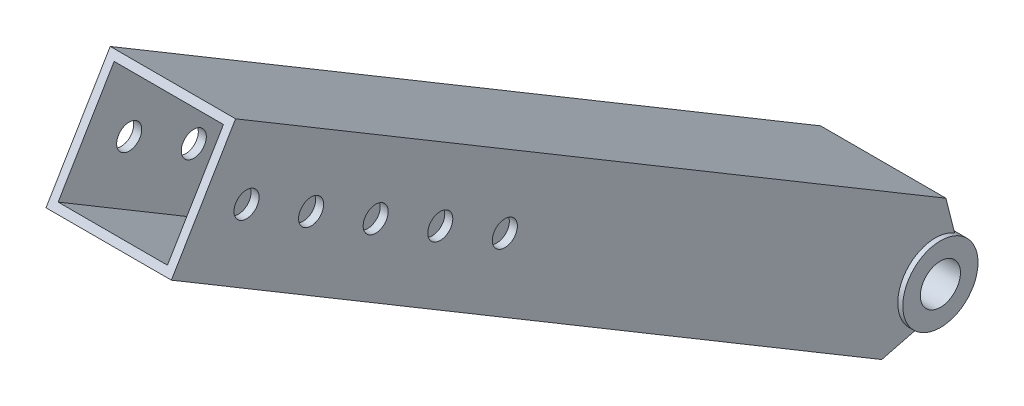
ISO-10303-21;
HEADER;
FILE_DESCRIPTION(('STEP AP214'),'2;1');
FILE_NAME('part.step','',(''),(''),'','','');
FILE_SCHEMA(('AUTOMOTIVE_DESIGN { 1 0 10303 214 1 1 1 1 }'));
ENDSEC;
DATA;
#1=APPLICATION_CONTEXT('core data for automotive mechanical design processes');
#2=APPLICATION_PROTOCOL_DEFINITION('international standard','automotive_design',2000,#1);
#3=PRODUCT_CONTEXT('',#1,'mechanical');
#4=PRODUCT('Part','Part','',(#3));
#5=PRODUCT_RELATED_PRODUCT_CATEGORY('part','',(#4));
#6=PRODUCT_DEFINITION_FORMATION('','',#4);
#7=PRODUCT_DEFINITION_CONTEXT('part definition',#1,'design');
#8=PRODUCT_DEFINITION('design','',#6,#7);
#9=PRODUCT_DEFINITION_SHAPE('','',#8);
#10=(LENGTH_UNIT() NAMED_UNIT(*) SI_UNIT(.MILLI.,.METRE.));
#11=(NAMED_UNIT(*) PLANE_ANGLE_UNIT() SI_UNIT($,.RADIAN.));
#12=(NAMED_UNIT(*) SI_UNIT($,.STERADIAN.) SOLID_ANGLE_UNIT());
#13=UNCERTAINTY_MEASURE_WITH_UNIT(LENGTH_MEASURE(1.E-05),#10,'distance_accuracy_value','');
#14=(GEOMETRIC_REPRESENTATION_CONTEXT(3) GLOBAL_UNCERTAINTY_ASSIGNED_CONTEXT((#13)) GLOBAL_UNIT_ASSIGNED_CONTEXT((#10,
#11,#12)) REPRESENTATION_CONTEXT('',''));
#15=CARTESIAN_POINT('',(0.,0.,0.));
#16=DIRECTION('',(0.,0.,1.));
#17=DIRECTION('',(1.,0.,0.));
#18=AXIS2_PLACEMENT_3D('',#15,#16,#17);
#19=CARTESIAN_POINT('',(12.5,50.2404489018823,-146.473206748013));
#20=DIRECTION('',(1.,0.,0.));
#21=DIRECTION('',(0.,0.,-1.));
#22=AXIS2_PLACEMENT_3D('',#19,#20,#21);
#23=PLANE('',#22);
#24=CARTESIAN_POINT('',(12.5,25.1008890559165,-212.988261666063));
#25=DIRECTION('',(1.,0.,0.));
#26=DIRECTION('',(0.,0.,-1.));
#27=AXIS2_PLACEMENT_3D('',#24,#25,#26);
#28=CIRCLE('',#27,2.5);
#29=CARTESIAN_POINT('',(12.5,25.1008890559165,-215.488261666063));
#30=VERTEX_POINT('',#29);
#31=EDGE_CURVE('E236',#30,#30,#28,.T.);
#32=ORIENTED_EDGE('',*,*,#31,.F.);
#33=EDGE_LOOP('',(#32));
#34=FACE_BOUND('',#33,.T.);
#35=CARTESIAN_POINT('',(12.5,32.7880308379483,-200.107739501844));
#36=DIRECTION('',(1.,0.,0.));
#37=DIRECTION('',(0.,0.,-1.));
#38=AXIS2_PLACEMENT_3D('',#35,#36,#37);
#39=CIRCLE('',#38,2.5);
#40=CARTESIAN_POINT('',(12.5,32.7880308379483,-202.607739501844));
#41=VERTEX_POINT('',#40);
#42=EDGE_CURVE('E226',#41,#41,#39,.T.);
#43=ORIENTED_EDGE('',*,*,#42,.F.);
#44=EDGE_LOOP('',(#43));
#45=FACE_BOUND('',#44,.T.);
#46=CARTESIAN_POINT('',(12.5,40.4751726199801,-187.227217337624));
#47=DIRECTION('',(1.,0.,0.));
#48=DIRECTION('',(0.,0.,-1.));
#49=AXIS2_PLACEMENT_3D('',#46,#47,#48);
#50=CIRCLE('',#49,2.5);
#51=CARTESIAN_POINT('',(12.5,40.4751726199801,-189.727217337624));
#52=VERTEX_POINT('',#51);
#53=EDGE_CURVE('E216',#52,#52,#50,.T.);
#54=ORIENTED_EDGE('',*,*,#53,.F.);
#55=EDGE_LOOP('',(#54));
#56=FACE_BOUND('',#55,.T.);
#57=CARTESIAN_POINT('',(12.5,48.1623144020119,-174.346695173405));
#58=DIRECTION('',(1.,0.,0.));
#59=DIRECTION('',(0.,0.,-1.));
#60=AXIS2_PLACEMENT_3D('',#57,#58,#59);
#61=CIRCLE('',#60,2.5);
#62=CARTESIAN_POINT('',(12.5,48.1623144020119,-176.846695173405));
#63=VERTEX_POINT('',#62);
#64=EDGE_CURVE('E206',#63,#63,#61,.T.);
#65=ORIENTED_EDGE('',*,*,#64,.F.);
#66=EDGE_LOOP('',(#65));
#67=FACE_BOUND('',#66,.T.);
#68=CARTESIAN_POINT('',(12.5,55.8494561840437,-161.466173009186));
#69=DIRECTION('',(1.,0.,0.));
#70=DIRECTION('',(0.,0.,-1.));
#71=AXIS2_PLACEMENT_3D('',#68,#69,#70);
#72=CIRCLE('',#71,2.5);
#73=CARTESIAN_POINT('',(12.5,55.8494561840437,-163.966173009186));
#74=VERTEX_POINT('',#73);
#75=EDGE_CURVE('E194',#74,#74,#72,.T.);
#76=ORIENTED_EDGE('',*,*,#75,.F.);
#77=EDGE_LOOP('',(#76));
#78=FACE_BOUND('',#77,.T.);
#79=CARTESIAN_POINT('',(12.5,-26.1467228242954,-298.858409427524));
#80=DIRECTION('',(1.,0.,0.));
#81=DIRECTION('',(0.,0.,-1.));
#82=AXIS2_PLACEMENT_3D('',#79,#80,#81);
#83=CIRCLE('',#82,7.50000000000001);
#84=CARTESIAN_POINT('',(12.5,-19.7064617421858,-302.70198031854));
#85=VERTEX_POINT('',#84);
#86=CARTESIAN_POINT('',(12.5,-32.586983906405,-295.014838536508));
#87=VERTEX_POINT('',#86);
#88=EDGE_CURVE('E165',#85,#87,#83,.T.);
#89=ORIENTED_EDGE('',*,*,#88,.F.);
#90=DIRECTION('',(0.,-0.969568976637342,-0.244818299035056));
#91=VECTOR('',#90,1.);
#92=CARTESIAN_POINT('',(12.5,83.1318579890687,-276.735078407603));
#93=LINE('',#92,#91);
#94=CARTESIAN_POINT('',(12.5,-12.8505737601021,-300.970853524477));
#95=VERTEX_POINT('',#94);
#96=EDGE_CURVE('E164',#85,#95,#93,.F.);
#97=ORIENTED_EDGE('',*,*,#96,.T.);
#98=DIRECTION('',(0.,-0.512476118802119,-0.858701477614611));
#99=VECTOR('',#98,1.);
#100=CARTESIAN_POINT('',(12.5,71.7079858422476,-159.285109718066));
#101=LINE('',#100,#99);
#102=CARTESIAN_POINT('',(12.5,71.7079858422476,-159.285109718066));
#103=VERTEX_POINT('',#102);
#104=EDGE_CURVE('E159',#103,#95,#101,.T.);
#105=ORIENTED_EDGE('',*,*,#104,.F.);
#106=DIRECTION('',(0.,-0.858701477614611,0.512476118802119));
#107=VECTOR('',#106,1.);
#108=CARTESIAN_POINT('',(12.5,50.2404489018823,-146.473206748013));
#109=LINE('',#108,#107);
#110=CARTESIAN_POINT('',(12.5,50.2404489018823,-146.473206748013));
#111=VERTEX_POINT('',#110);
#112=EDGE_CURVE('E518',#103,#111,#109,.T.);
#113=ORIENTED_EDGE('',*,*,#112,.T.);
#114=DIRECTION('',(0.,-0.512476118802119,-0.858701477614611));
#115=VECTOR('',#114,1.);
#116=CARTESIAN_POINT('',(12.5,50.2404489018823,-146.473206748013));
#117=LINE('',#116,#115);
#118=CARTESIAN_POINT('',(12.5,-34.3181107004674,-288.158950554424));
#119=VERTEX_POINT('',#118);
#120=EDGE_CURVE('E508',#111,#119,#117,.T.);
#121=ORIENTED_EDGE('',*,*,#120,.T.);
#122=DIRECTION('',(0.,-0.244818299035069,0.969568976637338));
#123=VECTOR('',#122,1.);
#124=CARTESIAN_POINT('',(12.5,-62.8817028024989,-175.036798850046));
#125=LINE('',#124,#123);
#126=EDGE_CURVE('E146',#119,#87,#125,.F.);
#127=ORIENTED_EDGE('',*,*,#126,.T.);
#128=EDGE_LOOP('',(#89,#97,#105,#113,#121,#127));
#129=FACE_BOUND('',#128,.T.);
#130=ADVANCED_FACE('F43',(#34,#45,#56,#67,#78,#129),#23,.T.);
#131=CARTESIAN_POINT('',(-12.5,71.7079858422476,-159.285109718066));
#132=DIRECTION('',(0.,0.858701477614611,-0.512476118802119));
#133=DIRECTION('',(0.,0.512476118802119,0.858701477614611));
#134=AXIS2_PLACEMENT_3D('',#131,#132,#133);
#135=PLANE('',#134);
#136=ORIENTED_EDGE('',*,*,#104,.T.);
#137=DIRECTION('',(-1.,0.,0.));
#138=VECTOR('',#137,1.);
#139=CARTESIAN_POINT('',(-12.5,-12.8505737601021,-300.970853524477));
#140=LINE('',#139,#138);
#141=CARTESIAN_POINT('',(-12.5,-12.8505737601021,-300.970853524477));
#142=VERTEX_POINT('',#141);
#143=EDGE_CURVE('E69',#95,#142,#140,.T.);
#144=ORIENTED_EDGE('',*,*,#143,.T.);
#145=DIRECTION('',(0.,-0.512476118802119,-0.858701477614611));
#146=VECTOR('',#145,1.);
#147=CARTESIAN_POINT('',(-12.5,71.7079858422476,-159.285109718066));
#148=LINE('',#147,#146);
#149=CARTESIAN_POINT('',(-12.5,71.7079858422476,-159.285109718066));
#150=VERTEX_POINT('',#149);
#151=EDGE_CURVE('E339',#150,#142,#148,.T.);
#152=ORIENTED_EDGE('',*,*,#151,.F.);
#153=DIRECTION('',(1.,0.,0.));
#154=VECTOR('',#153,1.);
#155=CARTESIAN_POINT('',(-12.5,71.7079858422476,-159.285109718066));
#156=LINE('',#155,#154);
#157=EDGE_CURVE('E510',#150,#103,#156,.T.);
#158=ORIENTED_EDGE('',*,*,#157,.T.);
#159=EDGE_LOOP('',(#136,#144,#152,#158));
#160=FACE_BOUND('',#159,.T.);
#161=ADVANCED_FACE('F267',(#160),#135,.T.);
#162=CARTESIAN_POINT('',(-12.5,50.2404489018823,-146.473206748013));
#163=DIRECTION('',(-1.,0.,0.));
#164=DIRECTION('',(0.,0.,1.));
#165=AXIS2_PLACEMENT_3D('',#162,#163,#164);
#166=PLANE('',#165);
#167=CARTESIAN_POINT('',(-12.5,25.1008890559165,-212.988261666063));
#168=DIRECTION('',(-1.,0.,0.));
#169=DIRECTION('',(0.,0.,1.));
#170=AXIS2_PLACEMENT_3D('',#167,#168,#169);
#171=CIRCLE('',#170,2.5);
#172=CARTESIAN_POINT('',(-12.5,25.1008890559165,-210.488261666063));
#173=VERTEX_POINT('',#172);
#174=EDGE_CURVE('E239',#173,#173,#171,.T.);
#175=ORIENTED_EDGE('',*,*,#174,.F.);
#176=EDGE_LOOP('',(#175));
#177=FACE_BOUND('',#176,.T.);
#178=CARTESIAN_POINT('',(-12.5,32.7880308379483,-200.107739501844));
#179=DIRECTION('',(-1.,0.,0.));
#180=DIRECTION('',(0.,0.,1.));
#181=AXIS2_PLACEMENT_3D('',#178,#179,#180);
#182=CIRCLE('',#181,2.5);
#183=CARTESIAN_POINT('',(-12.5,32.7880308379483,-197.607739501844));
#184=VERTEX_POINT('',#183);
#185=EDGE_CURVE('E229',#184,#184,#182,.T.);
#186=ORIENTED_EDGE('',*,*,#185,.F.);
#187=EDGE_LOOP('',(#186));
#188=FACE_BOUND('',#187,.T.);
#189=CARTESIAN_POINT('',(-12.5,40.4751726199801,-187.227217337624));
#190=DIRECTION('',(-1.,0.,0.));
#191=DIRECTION('',(0.,0.,1.));
#192=AXIS2_PLACEMENT_3D('',#189,#190,#191);
#193=CIRCLE('',#192,2.5);
#194=CARTESIAN_POINT('',(-12.5,40.4751726199801,-184.727217337624));
#195=VERTEX_POINT('',#194);
#196=EDGE_CURVE('E219',#195,#195,#193,.T.);
#197=ORIENTED_EDGE('',*,*,#196,.F.);
#198=EDGE_LOOP('',(#197));
#199=FACE_BOUND('',#198,.T.);
#200=CARTESIAN_POINT('',(-12.5,48.1623144020119,-174.346695173405));
#201=DIRECTION('',(-1.,0.,0.));
#202=DIRECTION('',(0.,0.,1.));
#203=AXIS2_PLACEMENT_3D('',#200,#201,#202);
#204=CIRCLE('',#203,2.5);
#205=CARTESIAN_POINT('',(-12.5,48.1623144020119,-171.846695173405));
#206=VERTEX_POINT('',#205);
#207=EDGE_CURVE('E209',#206,#206,#204,.T.);
#208=ORIENTED_EDGE('',*,*,#207,.F.);
#209=EDGE_LOOP('',(#208));
#210=FACE_BOUND('',#209,.T.);
#211=CARTESIAN_POINT('',(-12.5,55.8494561840437,-161.466173009186));
#212=DIRECTION('',(-1.,0.,0.));
#213=DIRECTION('',(0.,0.,1.));
#214=AXIS2_PLACEMENT_3D('',#211,#212,#213);
#215=CIRCLE('',#214,2.5);
#216=CARTESIAN_POINT('',(-12.5,55.8494561840437,-158.966173009186));
#217=VERTEX_POINT('',#216);
#218=EDGE_CURVE('E199',#217,#217,#215,.T.);
#219=ORIENTED_EDGE('',*,*,#218,.F.);
#220=EDGE_LOOP('',(#219));
#221=FACE_BOUND('',#220,.T.);
#222=ORIENTED_EDGE('',*,*,#151,.T.);
#223=DIRECTION('',(0.,0.969568976637342,0.244818299035056));
#224=VECTOR('',#223,1.);
#225=CARTESIAN_POINT('',(-12.5,83.1318579890687,-276.735078407603));
#226=LINE('',#225,#224);
#227=CARTESIAN_POINT('',(-12.5,-19.7064617421858,-302.70198031854));
#228=VERTEX_POINT('',#227);
#229=EDGE_CURVE('E340',#142,#228,#226,.F.);
#230=ORIENTED_EDGE('',*,*,#229,.T.);
#231=CARTESIAN_POINT('',(-12.5,-26.1467228242954,-298.858409427524));
#232=DIRECTION('',(-1.,0.,0.));
#233=DIRECTION('',(0.,0.,1.));
#234=AXIS2_PLACEMENT_3D('',#231,#232,#233);
#235=CIRCLE('',#234,7.50000000000001);
#236=CARTESIAN_POINT('',(-12.5,-32.586983906405,-295.014838536508));
#237=VERTEX_POINT('',#236);
#238=EDGE_CURVE('E174',#237,#228,#235,.T.);
#239=ORIENTED_EDGE('',*,*,#238,.F.);
#240=DIRECTION('',(0.,0.244818299035069,-0.969568976637338));
#241=VECTOR('',#240,1.);
#242=CARTESIAN_POINT('',(-12.5,-62.8817028024989,-175.036798850046));
#243=LINE('',#242,#241);
#244=CARTESIAN_POINT('',(-12.5,-34.3181107004674,-288.158950554424));
#245=VERTEX_POINT('',#244);
#246=EDGE_CURVE('E61',#237,#245,#243,.F.);
#247=ORIENTED_EDGE('',*,*,#246,.T.);
#248=DIRECTION('',(0.,-0.512476118802119,-0.858701477614611));
#249=VECTOR('',#248,1.);
#250=CARTESIAN_POINT('',(-12.5,50.2404489018823,-146.473206748013));
#251=LINE('',#250,#249);
#252=CARTESIAN_POINT('',(-12.5,50.2404489018823,-146.473206748013));
#253=VERTEX_POINT('',#252);
#254=EDGE_CURVE('E345',#253,#245,#251,.T.);
#255=ORIENTED_EDGE('',*,*,#254,.F.);
#256=DIRECTION('',(0.,0.858701477614611,-0.512476118802119));
#257=VECTOR('',#256,1.);
#258=CARTESIAN_POINT('',(-12.5,50.2404489018823,-146.473206748013));
#259=LINE('',#258,#257);
#260=EDGE_CURVE('E342',#253,#150,#259,.T.);
#261=ORIENTED_EDGE('',*,*,#260,.T.);
#262=EDGE_LOOP('',(#222,#230,#239,#247,#255,#261));
#263=FACE_BOUND('',#262,.T.);
#264=ADVANCED_FACE('F274',(#177,#188,#199,#210,#221,#263),#166,.T.);
#265=CARTESIAN_POINT('',(-12.5,50.2404489018823,-146.473206748013));
#266=DIRECTION('',(0.,-0.858701477614611,0.512476118802119));
#267=DIRECTION('',(0.,-0.512476118802119,-0.858701477614611));
#268=AXIS2_PLACEMENT_3D('',#265,#266,#267);
#269=PLANE('',#268);
#270=ORIENTED_EDGE('',*,*,#254,.T.);
#271=DIRECTION('',(1.,0.,0.));
#272=VECTOR('',#271,1.);
#273=CARTESIAN_POINT('',(-12.5,-34.3181107004674,-288.158950554424));
#274=LINE('',#273,#272);
#275=EDGE_CURVE('E11',#245,#119,#274,.T.);
#276=ORIENTED_EDGE('',*,*,#275,.T.);
#277=ORIENTED_EDGE('',*,*,#120,.F.);
#278=DIRECTION('',(-1.,0.,0.));
#279=VECTOR('',#278,1.);
#280=CARTESIAN_POINT('',(-12.5,50.2404489018823,-146.473206748013));
#281=LINE('',#280,#279);
#282=EDGE_CURVE('E515',#111,#253,#281,.T.);
#283=ORIENTED_EDGE('',*,*,#282,.T.);
#284=EDGE_LOOP('',(#270,#276,#277,#283));
#285=FACE_BOUND('',#284,.T.);
#286=ADVANCED_FACE('F279',(#285),#269,.T.);
#287=CARTESIAN_POINT('',(0.,-51.2628471829977,-85.8956759305487));
#288=DIRECTION('',(0.,-0.512476118802119,-0.858701477614611));
#289=DIRECTION('',(0.,0.858701477614611,-0.512476118802119));
#290=AXIS2_PLACEMENT_3D('',#287,#288,#289);
#291=PLANE('',#290);
#292=DIRECTION('',(-1.,0.,0.));
#293=VECTOR('',#292,1.);
#294=CARTESIAN_POINT('',(-10.9,51.6143712660657,-147.293168538097));
#295=LINE('',#294,#293);
#296=CARTESIAN_POINT('',(10.9,51.6143712660657,-147.293168538097));
#297=VERTEX_POINT('',#296);
#298=CARTESIAN_POINT('',(-10.9,51.6143712660657,-147.293168538097));
#299=VERTEX_POINT('',#298);
#300=EDGE_CURVE('E525',#297,#299,#295,.T.);
#301=ORIENTED_EDGE('',*,*,#300,.T.);
#302=DIRECTION('',(0.,0.85870147761461,-0.51247611880212));
#303=VECTOR('',#302,1.);
#304=CARTESIAN_POINT('',(-10.9,51.6143712660657,-147.293168538097));
#305=LINE('',#304,#303);
#306=CARTESIAN_POINT('',(-10.9,70.3340634780642,-158.465147927983));
#307=VERTEX_POINT('',#306);
#308=EDGE_CURVE('E180',#299,#307,#305,.T.);
#309=ORIENTED_EDGE('',*,*,#308,.T.);
#310=DIRECTION('',(1.,0.,0.));
#311=VECTOR('',#310,1.);
#312=CARTESIAN_POINT('',(-10.9,70.3340634780642,-158.465147927983));
#313=LINE('',#312,#311);
#314=CARTESIAN_POINT('',(10.9,70.3340634780642,-158.465147927983));
#315=VERTEX_POINT('',#314);
#316=EDGE_CURVE('E536',#307,#315,#313,.T.);
#317=ORIENTED_EDGE('',*,*,#316,.T.);
#318=DIRECTION('',(0.,-0.85870147761461,0.51247611880212));
#319=VECTOR('',#318,1.);
#320=CARTESIAN_POINT('',(10.9,51.6143712660657,-147.293168538097));
#321=LINE('',#320,#319);
#322=EDGE_CURVE('E533',#315,#297,#321,.T.);
#323=ORIENTED_EDGE('',*,*,#322,.T.);
#324=EDGE_LOOP('',(#301,#309,#317,#323));
#325=FACE_BOUND('',#324,.T.);
#326=ORIENTED_EDGE('',*,*,#112,.F.);
#327=ORIENTED_EDGE('',*,*,#157,.F.);
#328=ORIENTED_EDGE('',*,*,#260,.F.);
#329=ORIENTED_EDGE('',*,*,#282,.F.);
#330=EDGE_LOOP('',(#326,#327,#328,#329));
#331=FACE_BOUND('',#330,.T.);
#332=ADVANCED_FACE('F319',(#325,#331),#291,.F.);
#333=CARTESIAN_POINT('',(-10.9,51.6143712660657,-147.293168538097));
#334=DIRECTION('',(-1.,0.,0.));
#335=DIRECTION('',(0.,-1.,0.));
#336=AXIS2_PLACEMENT_3D('',#333,#334,#335);
#337=PLANE('',#336);
#338=CARTESIAN_POINT('',(-10.9,25.1008890559165,-212.988261666063));
#339=DIRECTION('',(-1.,0.,0.));
#340=DIRECTION('',(0.,-1.,0.));
#341=AXIS2_PLACEMENT_3D('',#338,#339,#340);
#342=CIRCLE('',#341,2.5);
#343=CARTESIAN_POINT('',(-10.9,22.6008890559165,-212.988261666063));
#344=VERTEX_POINT('',#343);
#345=EDGE_CURVE('E242',#344,#344,#342,.T.);
#346=ORIENTED_EDGE('',*,*,#345,.T.);
#347=EDGE_LOOP('',(#346));
#348=FACE_BOUND('',#347,.T.);
#349=CARTESIAN_POINT('',(-10.9,32.7880308379483,-200.107739501844));
#350=DIRECTION('',(-1.,0.,0.));
#351=DIRECTION('',(0.,-1.,0.));
#352=AXIS2_PLACEMENT_3D('',#349,#350,#351);
#353=CIRCLE('',#352,2.5);
#354=CARTESIAN_POINT('',(-10.9,30.2880308379483,-200.107739501844));
#355=VERTEX_POINT('',#354);
#356=EDGE_CURVE('E232',#355,#355,#353,.T.);
#357=ORIENTED_EDGE('',*,*,#356,.T.);
#358=EDGE_LOOP('',(#357));
#359=FACE_BOUND('',#358,.T.);
#360=CARTESIAN_POINT('',(-10.9,40.4751726199801,-187.227217337624));
#361=DIRECTION('',(-1.,0.,0.));
#362=DIRECTION('',(0.,-1.,0.));
#363=AXIS2_PLACEMENT_3D('',#360,#361,#362);
#364=CIRCLE('',#363,2.5);
#365=CARTESIAN_POINT('',(-10.9,37.9751726199801,-187.227217337624));
#366=VERTEX_POINT('',#365);
#367=EDGE_CURVE('E222',#366,#366,#364,.T.);
#368=ORIENTED_EDGE('',*,*,#367,.T.);
#369=EDGE_LOOP('',(#368));
#370=FACE_BOUND('',#369,.T.);
#371=CARTESIAN_POINT('',(-10.9,48.1623144020119,-174.346695173405));
#372=DIRECTION('',(-1.,0.,0.));
#373=DIRECTION('',(0.,-1.,0.));
#374=AXIS2_PLACEMENT_3D('',#371,#372,#373);
#375=CIRCLE('',#374,2.5);
#376=CARTESIAN_POINT('',(-10.9,45.6623144020119,-174.346695173405));
#377=VERTEX_POINT('',#376);
#378=EDGE_CURVE('E212',#377,#377,#375,.T.);
#379=ORIENTED_EDGE('',*,*,#378,.T.);
#380=EDGE_LOOP('',(#379));
#381=FACE_BOUND('',#380,.T.);
#382=CARTESIAN_POINT('',(-10.9,55.8494561840437,-161.466173009186));
#383=DIRECTION('',(-1.,0.,0.));
#384=DIRECTION('',(0.,-1.,0.));
#385=AXIS2_PLACEMENT_3D('',#382,#383,#384);
#386=CIRCLE('',#385,2.5);
#387=CARTESIAN_POINT('',(-10.9,53.3494561840437,-161.466173009186));
#388=VERTEX_POINT('',#387);
#389=EDGE_CURVE('E202',#388,#388,#386,.T.);
#390=ORIENTED_EDGE('',*,*,#389,.T.);
#391=EDGE_LOOP('',(#390));
#392=FACE_BOUND('',#391,.T.);
#393=CARTESIAN_POINT('',(-10.9,-26.1467228242954,-298.858409427524));
#394=DIRECTION('',(-1.,0.,0.));
#395=DIRECTION('',(0.,-1.,0.));
#396=AXIS2_PLACEMENT_3D('',#393,#394,#395);
#397=CIRCLE('',#396,7.50000000000001);
#398=CARTESIAN_POINT('',(-10.9,-32.586983906405,-295.014838536508));
#399=VERTEX_POINT('',#398);
#400=CARTESIAN_POINT('',(-10.9,-19.7064617421858,-302.70198031854));
#401=VERTEX_POINT('',#400);
#402=EDGE_CURVE('E168',#399,#401,#397,.T.);
#403=ORIENTED_EDGE('',*,*,#402,.T.);
#404=DIRECTION('',(0.,-0.969568976637342,-0.244818299035056));
#405=VECTOR('',#404,1.);
#406=CARTESIAN_POINT('',(-10.9,-19.7064617421858,-302.70198031854));
#407=LINE('',#406,#405);
#408=CARTESIAN_POINT('',(-10.9,-15.0444579143688,-301.524814098577));
#409=VERTEX_POINT('',#408);
#410=EDGE_CURVE('E501',#401,#409,#407,.F.);
#411=ORIENTED_EDGE('',*,*,#410,.T.);
#412=DIRECTION('',(0.,-0.512476118802119,-0.858701477614611));
#413=VECTOR('',#412,1.);
#414=CARTESIAN_POINT('',(-10.9,70.3340634780642,-158.465147927983));
#415=LINE('',#414,#413);
#416=EDGE_CURVE('E522',#307,#409,#415,.T.);
#417=ORIENTED_EDGE('',*,*,#416,.F.);
#418=ORIENTED_EDGE('',*,*,#308,.F.);
#419=DIRECTION('',(0.,-0.512476118802119,-0.858701477614611));
#420=VECTOR('',#419,1.);
#421=CARTESIAN_POINT('',(-10.9,51.6143712660657,-147.293168538097));
#422=LINE('',#421,#420);
#423=CARTESIAN_POINT('',(-10.9,-33.7641501263674,-290.352834708691));
#424=VERTEX_POINT('',#423);
#425=EDGE_CURVE('E521',#299,#424,#422,.T.);
#426=ORIENTED_EDGE('',*,*,#425,.T.);
#427=DIRECTION('',(0.,-0.244818299035069,0.969568976637338));
#428=VECTOR('',#427,1.);
#429=CARTESIAN_POINT('',(-10.9,-32.5869839064048,-295.014838536508));
#430=LINE('',#429,#428);
#431=EDGE_CURVE('E158',#424,#399,#430,.F.);
#432=ORIENTED_EDGE('',*,*,#431,.T.);
#433=EDGE_LOOP('',(#403,#411,#417,#418,#426,#432));
#434=FACE_BOUND('',#433,.T.);
#435=ADVANCED_FACE('F309',(#348,#359,#370,#381,#392,#434),#337,.F.);
#436=CARTESIAN_POINT('',(-10.9,51.6143712660657,-147.293168538097));
#437=DIRECTION('',(0.,-0.858701477614611,0.512476118802119));
#438=DIRECTION('',(0.,-0.512476118802119,-0.858701477614611));
#439=AXIS2_PLACEMENT_3D('',#436,#437,#438);
#440=PLANE('',#439);
#441=DIRECTION('',(0.,-0.512476118802119,-0.858701477614611));
#442=VECTOR('',#441,1.);
#443=CARTESIAN_POINT('',(10.9,51.6143712660657,-147.293168538097));
#444=LINE('',#443,#442);
#445=CARTESIAN_POINT('',(10.9,-33.7641501263674,-290.352834708691));
#446=VERTEX_POINT('',#445);
#447=EDGE_CURVE('E527',#297,#446,#444,.T.);
#448=ORIENTED_EDGE('',*,*,#447,.T.);
#449=DIRECTION('',(1.,0.,0.));
#450=VECTOR('',#449,1.);
#451=CARTESIAN_POINT('',(0.,-33.7641501263674,-290.352834708691));
#452=LINE('',#451,#450);
#453=EDGE_CURVE('E53',#446,#424,#452,.F.);
#454=ORIENTED_EDGE('',*,*,#453,.T.);
#455=ORIENTED_EDGE('',*,*,#425,.F.);
#456=ORIENTED_EDGE('',*,*,#300,.F.);
#457=EDGE_LOOP('',(#448,#454,#455,#456));
#458=FACE_BOUND('',#457,.T.);
#459=ADVANCED_FACE('F306',(#458),#440,.F.);
#460=CARTESIAN_POINT('',(10.9,51.6143712660657,-147.293168538097));
#461=DIRECTION('',(1.,0.,0.));
#462=DIRECTION('',(0.,1.,0.));
#463=AXIS2_PLACEMENT_3D('',#460,#461,#462);
#464=PLANE('',#463);
#465=CARTESIAN_POINT('',(10.9,25.1008890559165,-212.988261666063));
#466=DIRECTION('',(1.,0.,0.));
#467=DIRECTION('',(0.,1.,0.));
#468=AXIS2_PLACEMENT_3D('',#465,#466,#467);
#469=CIRCLE('',#468,2.5);
#470=CARTESIAN_POINT('',(10.9,27.6008890559165,-212.988261666063));
#471=VERTEX_POINT('',#470);
#472=EDGE_CURVE('E48',#471,#471,#469,.T.);
#473=ORIENTED_EDGE('',*,*,#472,.T.);
#474=EDGE_LOOP('',(#473));
#475=FACE_BOUND('',#474,.T.);
#476=CARTESIAN_POINT('',(10.9,32.7880308379483,-200.107739501844));
#477=DIRECTION('',(1.,0.,0.));
#478=DIRECTION('',(0.,1.,0.));
#479=AXIS2_PLACEMENT_3D('',#476,#477,#478);
#480=CIRCLE('',#479,2.5);
#481=CARTESIAN_POINT('',(10.9,35.2880308379483,-200.107739501844));
#482=VERTEX_POINT('',#481);
#483=EDGE_CURVE('E235',#482,#482,#480,.T.);
#484=ORIENTED_EDGE('',*,*,#483,.T.);
#485=EDGE_LOOP('',(#484));
#486=FACE_BOUND('',#485,.T.);
#487=CARTESIAN_POINT('',(10.9,40.4751726199801,-187.227217337624));
#488=DIRECTION('',(1.,0.,0.));
#489=DIRECTION('',(0.,1.,0.));
#490=AXIS2_PLACEMENT_3D('',#487,#488,#489);
#491=CIRCLE('',#490,2.5);
#492=CARTESIAN_POINT('',(10.9,42.9751726199801,-187.227217337624));
#493=VERTEX_POINT('',#492);
#494=EDGE_CURVE('E225',#493,#493,#491,.T.);
#495=ORIENTED_EDGE('',*,*,#494,.T.);
#496=EDGE_LOOP('',(#495));
#497=FACE_BOUND('',#496,.T.);
#498=CARTESIAN_POINT('',(10.9,48.1623144020119,-174.346695173405));
#499=DIRECTION('',(1.,0.,0.));
#500=DIRECTION('',(0.,1.,0.));
#501=AXIS2_PLACEMENT_3D('',#498,#499,#500);
#502=CIRCLE('',#501,2.5);
#503=CARTESIAN_POINT('',(10.9,50.6623144020119,-174.346695173405));
#504=VERTEX_POINT('',#503);
#505=EDGE_CURVE('E215',#504,#504,#502,.T.);
#506=ORIENTED_EDGE('',*,*,#505,.T.);
#507=EDGE_LOOP('',(#506));
#508=FACE_BOUND('',#507,.T.);
#509=CARTESIAN_POINT('',(10.9,55.8494561840437,-161.466173009186));
#510=DIRECTION('',(1.,0.,0.));
#511=DIRECTION('',(0.,1.,0.));
#512=AXIS2_PLACEMENT_3D('',#509,#510,#511);
#513=CIRCLE('',#512,2.5);
#514=CARTESIAN_POINT('',(10.9,58.3494561840437,-161.466173009186));
#515=VERTEX_POINT('',#514);
#516=EDGE_CURVE('E205',#515,#515,#513,.T.);
#517=ORIENTED_EDGE('',*,*,#516,.T.);
#518=EDGE_LOOP('',(#517));
#519=FACE_BOUND('',#518,.T.);
#520=DIRECTION('',(0.,-0.512476118802119,-0.858701477614611));
#521=VECTOR('',#520,1.);
#522=CARTESIAN_POINT('',(10.9,70.3340634780642,-158.465147927983));
#523=LINE('',#522,#521);
#524=CARTESIAN_POINT('',(10.9,-15.0444579143688,-301.524814098577));
#525=VERTEX_POINT('',#524);
#526=EDGE_CURVE('E142',#315,#525,#523,.T.);
#527=ORIENTED_EDGE('',*,*,#526,.T.);
#528=DIRECTION('',(0.,0.969568976637342,0.244818299035056));
#529=VECTOR('',#528,1.);
#530=CARTESIAN_POINT('',(10.9,-19.7064617421858,-302.70198031854));
#531=LINE('',#530,#529);
#532=CARTESIAN_POINT('',(10.9,-19.7064617421858,-302.70198031854));
#533=VERTEX_POINT('',#532);
#534=EDGE_CURVE('E137',#525,#533,#531,.F.);
#535=ORIENTED_EDGE('',*,*,#534,.T.);
#536=CARTESIAN_POINT('',(10.9,-26.1467228242954,-298.858409427524));
#537=DIRECTION('',(1.,0.,0.));
#538=DIRECTION('',(0.,1.,0.));
#539=AXIS2_PLACEMENT_3D('',#536,#537,#538);
#540=CIRCLE('',#539,7.50000000000001);
#541=CARTESIAN_POINT('',(10.9,-32.586983906405,-295.014838536508));
#542=VERTEX_POINT('',#541);
#543=EDGE_CURVE('E140',#533,#542,#540,.T.);
#544=ORIENTED_EDGE('',*,*,#543,.T.);
#545=DIRECTION('',(0.,0.244818299035069,-0.969568976637338));
#546=VECTOR('',#545,1.);
#547=CARTESIAN_POINT('',(10.9,-32.5869839064048,-295.014838536508));
#548=LINE('',#547,#546);
#549=EDGE_CURVE('E147',#542,#446,#548,.F.);
#550=ORIENTED_EDGE('',*,*,#549,.T.);
#551=ORIENTED_EDGE('',*,*,#447,.F.);
#552=ORIENTED_EDGE('',*,*,#322,.F.);
#553=EDGE_LOOP('',(#527,#535,#544,#550,#551,#552));
#554=FACE_BOUND('',#553,.T.);
#555=ADVANCED_FACE('F139',(#475,#486,#497,#508,#519,#554),#464,.F.);
#556=CARTESIAN_POINT('',(-10.9,70.3340634780642,-158.465147927983));
#557=DIRECTION('',(0.,0.858701477614611,-0.512476118802119));
#558=DIRECTION('',(0.,0.512476118802119,0.858701477614611));
#559=AXIS2_PLACEMENT_3D('',#556,#557,#558);
#560=PLANE('',#559);
#561=ORIENTED_EDGE('',*,*,#416,.T.);
#562=DIRECTION('',(-1.,0.,0.));
#563=VECTOR('',#562,1.);
#564=CARTESIAN_POINT('',(0.,-15.0444579143688,-301.524814098577));
#565=LINE('',#564,#563);
#566=EDGE_CURVE('E499',#409,#525,#565,.F.);
#567=ORIENTED_EDGE('',*,*,#566,.T.);
#568=ORIENTED_EDGE('',*,*,#526,.F.);
#569=ORIENTED_EDGE('',*,*,#316,.F.);
#570=EDGE_LOOP('',(#561,#567,#568,#569));
#571=FACE_BOUND('',#570,.T.);
#572=ADVANCED_FACE('F313',(#571),#560,.F.);
#573=CARTESIAN_POINT('',(13.5,-26.1467228242954,-298.858409427524));
#574=DIRECTION('',(1.,0.,0.));
#575=DIRECTION('',(0.,0.,-1.));
#576=AXIS2_PLACEMENT_3D('',#573,#574,#575);
#577=PLANE('',#576);
#578=CARTESIAN_POINT('',(13.5,-26.1467228242954,-298.858409427524));
#579=DIRECTION('',(1.,0.,0.));
#580=DIRECTION('',(0.,0.,-1.));
#581=AXIS2_PLACEMENT_3D('',#578,#579,#580);
#582=CIRCLE('',#581,7.50000000000001);
#583=CARTESIAN_POINT('',(13.5,-26.1467228242954,-306.358409427524));
#584=VERTEX_POINT('',#583);
#585=EDGE_CURVE('E191',#584,#584,#582,.T.);
#586=ORIENTED_EDGE('',*,*,#585,.T.);
#587=EDGE_LOOP('',(#586));
#588=FACE_BOUND('',#587,.T.);
#589=CARTESIAN_POINT('',(13.5,-26.1467228242954,-298.858409427524));
#590=DIRECTION('',(1.,0.,0.));
#591=DIRECTION('',(0.,0.,-1.));
#592=AXIS2_PLACEMENT_3D('',#589,#590,#591);
#593=CIRCLE('',#592,3.99999999999999);
#594=CARTESIAN_POINT('',(13.5,-26.1467228242954,-302.858409427524));
#595=VERTEX_POINT('',#594);
#596=EDGE_CURVE('E185',#595,#595,#593,.T.);
#597=ORIENTED_EDGE('',*,*,#596,.F.);
#598=EDGE_LOOP('',(#597));
#599=FACE_BOUND('',#598,.T.);
#600=ADVANCED_FACE('F304',(#588,#599),#577,.T.);
#601=CARTESIAN_POINT('',(-13.5,-26.1467228242954,-298.858409427524));
#602=DIRECTION('',(1.,0.,0.));
#603=DIRECTION('',(0.,0.,-1.));
#604=AXIS2_PLACEMENT_3D('',#601,#602,#603);
#605=PLANE('',#604);
#606=CARTESIAN_POINT('',(-13.5,-26.1467228242954,-298.858409427524));
#607=DIRECTION('',(1.,0.,0.));
#608=DIRECTION('',(0.,0.,-1.));
#609=AXIS2_PLACEMENT_3D('',#606,#607,#608);
#610=CIRCLE('',#609,7.50000000000001);
#611=CARTESIAN_POINT('',(-13.5,-26.1467228242954,-306.358409427524));
#612=VERTEX_POINT('',#611);
#613=EDGE_CURVE('E188',#612,#612,#610,.T.);
#614=ORIENTED_EDGE('',*,*,#613,.F.);
#615=EDGE_LOOP('',(#614));
#616=FACE_BOUND('',#615,.T.);
#617=CARTESIAN_POINT('',(-13.5,-26.1467228242954,-298.858409427524));
#618=DIRECTION('',(1.,0.,0.));
#619=DIRECTION('',(0.,0.,-1.));
#620=AXIS2_PLACEMENT_3D('',#617,#618,#619);
#621=CIRCLE('',#620,3.99999999999999);
#622=CARTESIAN_POINT('',(-13.5,-26.1467228242954,-302.858409427524));
#623=VERTEX_POINT('',#622);
#624=EDGE_CURVE('E170',#623,#623,#621,.T.);
#625=ORIENTED_EDGE('',*,*,#624,.T.);
#626=EDGE_LOOP('',(#625));
#627=FACE_BOUND('',#626,.T.);
#628=ADVANCED_FACE('F299',(#616,#627),#605,.F.);
#629=CARTESIAN_POINT('',(13.5,-26.1467228242954,-298.858409427524));
#630=DIRECTION('',(-1.,0.,0.));
#631=DIRECTION('',(0.,0.,1.));
#632=AXIS2_PLACEMENT_3D('',#629,#630,#631);
#633=CYLINDRICAL_SURFACE('',#632,7.50000000000001);
#634=DIRECTION('',(1.,0.,0.));
#635=VECTOR('',#634,1.);
#636=CARTESIAN_POINT('',(-85.,-19.7064617421858,-302.70198031854));
#637=LINE('',#636,#635);
#638=EDGE_CURVE('E167',#228,#401,#637,.T.);
#639=ORIENTED_EDGE('',*,*,#638,.T.);
#640=ORIENTED_EDGE('',*,*,#402,.F.);
#641=DIRECTION('',(1.,0.,0.));
#642=VECTOR('',#641,1.);
#643=CARTESIAN_POINT('',(-85.,-32.586983906405,-295.014838536508));
#644=LINE('',#643,#642);
#645=EDGE_CURVE('E172',#399,#237,#644,.F.);
#646=ORIENTED_EDGE('',*,*,#645,.T.);
#647=ORIENTED_EDGE('',*,*,#238,.T.);
#648=EDGE_LOOP('',(#639,#640,#646,#647));
#649=FACE_BOUND('',#648,.T.);
#650=EDGE_CURVE('E154',#533,#85,#637,.T.);
#651=ORIENTED_EDGE('',*,*,#650,.T.);
#652=ORIENTED_EDGE('',*,*,#88,.T.);
#653=EDGE_CURVE('E157',#87,#542,#644,.F.);
#654=ORIENTED_EDGE('',*,*,#653,.T.);
#655=ORIENTED_EDGE('',*,*,#543,.F.);
#656=EDGE_LOOP('',(#651,#652,#654,#655));
#657=FACE_BOUND('',#656,.T.);
#658=ORIENTED_EDGE('',*,*,#585,.F.);
#659=EDGE_LOOP('',(#658));
#660=FACE_BOUND('',#659,.T.);
#661=ORIENTED_EDGE('',*,*,#613,.T.);
#662=EDGE_LOOP('',(#661));
#663=FACE_BOUND('',#662,.T.);
#664=ADVANCED_FACE('F151',(#649,#657,#660,#663),#633,.T.);
#665=CARTESIAN_POINT('',(13.5,-26.1467228242954,-298.858409427524));
#666=DIRECTION('',(-1.,0.,0.));
#667=DIRECTION('',(0.,0.,1.));
#668=AXIS2_PLACEMENT_3D('',#665,#666,#667);
#669=CYLINDRICAL_SURFACE('',#668,3.99999999999999);
#670=ORIENTED_EDGE('',*,*,#596,.T.);
#671=EDGE_LOOP('',(#670));
#672=FACE_BOUND('',#671,.T.);
#673=ORIENTED_EDGE('',*,*,#624,.F.);
#674=EDGE_LOOP('',(#673));
#675=FACE_BOUND('',#674,.T.);
#676=ADVANCED_FACE('F285',(#672,#675),#669,.F.);
#677=CARTESIAN_POINT('',(0.,-19.7064617421858,-302.70198031854));
#678=DIRECTION('',(0.,-0.244818299035056,0.969568976637342));
#679=DIRECTION('',(1.,0.,0.));
#680=AXIS2_PLACEMENT_3D('',#677,#678,#679);
#681=PLANE('',#680);
#682=ORIENTED_EDGE('',*,*,#229,.F.);
#683=ORIENTED_EDGE('',*,*,#143,.F.);
#684=ORIENTED_EDGE('',*,*,#96,.F.);
#685=ORIENTED_EDGE('',*,*,#650,.F.);
#686=ORIENTED_EDGE('',*,*,#534,.F.);
#687=ORIENTED_EDGE('',*,*,#566,.F.);
#688=ORIENTED_EDGE('',*,*,#410,.F.);
#689=ORIENTED_EDGE('',*,*,#638,.F.);
#690=EDGE_LOOP('',(#682,#683,#684,#685,#686,#687,#688,#689));
#691=FACE_BOUND('',#690,.T.);
#692=ADVANCED_FACE('F163',(#691),#681,.F.);
#693=CARTESIAN_POINT('',(0.,-32.5869839064048,-295.014838536508));
#694=DIRECTION('',(0.,0.969568976637338,0.244818299035069));
#695=DIRECTION('',(-1.,0.,0.));
#696=AXIS2_PLACEMENT_3D('',#693,#694,#695);
#697=PLANE('',#696);
#698=ORIENTED_EDGE('',*,*,#126,.F.);
#699=ORIENTED_EDGE('',*,*,#275,.F.);
#700=ORIENTED_EDGE('',*,*,#246,.F.);
#701=ORIENTED_EDGE('',*,*,#645,.F.);
#702=ORIENTED_EDGE('',*,*,#431,.F.);
#703=ORIENTED_EDGE('',*,*,#453,.F.);
#704=ORIENTED_EDGE('',*,*,#549,.F.);
#705=ORIENTED_EDGE('',*,*,#653,.F.);
#706=EDGE_LOOP('',(#698,#699,#700,#701,#702,#703,#704,#705));
#707=FACE_BOUND('',#706,.T.);
#708=ADVANCED_FACE('F46',(#707),#697,.F.);
#709=CARTESIAN_POINT('',(-20.,55.8494561840437,-161.466173009186));
#710=DIRECTION('',(1.,0.,0.));
#711=DIRECTION('',(0.,0.,-1.));
#712=AXIS2_PLACEMENT_3D('',#709,#710,#711);
#713=CYLINDRICAL_SURFACE('',#712,2.5);
#714=ORIENTED_EDGE('',*,*,#75,.T.);
#715=EDGE_LOOP('',(#714));
#716=FACE_BOUND('',#715,.T.);
#717=ORIENTED_EDGE('',*,*,#516,.F.);
#718=EDGE_LOOP('',(#717));
#719=FACE_BOUND('',#718,.T.);
#720=ADVANCED_FACE('F291',(#716,#719),#713,.F.);
#721=ORIENTED_EDGE('',*,*,#218,.T.);
#722=EDGE_LOOP('',(#721));
#723=FACE_BOUND('',#722,.T.);
#724=ORIENTED_EDGE('',*,*,#389,.F.);
#725=EDGE_LOOP('',(#724));
#726=FACE_BOUND('',#725,.T.);
#727=ADVANCED_FACE('F377',(#723,#726),#713,.F.);
#728=CARTESIAN_POINT('',(-20.,48.1623144020119,-174.346695173405));
#729=DIRECTION('',(1.,0.,0.));
#730=DIRECTION('',(0.,0.,-1.));
#731=AXIS2_PLACEMENT_3D('',#728,#729,#730);
#732=CYLINDRICAL_SURFACE('',#731,2.5);
#733=ORIENTED_EDGE('',*,*,#64,.T.);
#734=EDGE_LOOP('',(#733));
#735=FACE_BOUND('',#734,.T.);
#736=ORIENTED_EDGE('',*,*,#505,.F.);
#737=EDGE_LOOP('',(#736));
#738=FACE_BOUND('',#737,.T.);
#739=ADVANCED_FACE('F375',(#735,#738),#732,.F.);
#740=ORIENTED_EDGE('',*,*,#207,.T.);
#741=EDGE_LOOP('',(#740));
#742=FACE_BOUND('',#741,.T.);
#743=ORIENTED_EDGE('',*,*,#378,.F.);
#744=EDGE_LOOP('',(#743));
#745=FACE_BOUND('',#744,.T.);
#746=ADVANCED_FACE('F372',(#742,#745),#732,.F.);
#747=CARTESIAN_POINT('',(-20.,40.4751726199801,-187.227217337624));
#748=DIRECTION('',(1.,0.,0.));
#749=DIRECTION('',(0.,0.,-1.));
#750=AXIS2_PLACEMENT_3D('',#747,#748,#749);
#751=CYLINDRICAL_SURFACE('',#750,2.5);
#752=ORIENTED_EDGE('',*,*,#53,.T.);
#753=EDGE_LOOP('',(#752));
#754=FACE_BOUND('',#753,.T.);
#755=ORIENTED_EDGE('',*,*,#494,.F.);
#756=EDGE_LOOP('',(#755));
#757=FACE_BOUND('',#756,.T.);
#758=ADVANCED_FACE('F368',(#754,#757),#751,.F.);
#759=ORIENTED_EDGE('',*,*,#196,.T.);
#760=EDGE_LOOP('',(#759));
#761=FACE_BOUND('',#760,.T.);
#762=ORIENTED_EDGE('',*,*,#367,.F.);
#763=EDGE_LOOP('',(#762));
#764=FACE_BOUND('',#763,.T.);
#765=ADVANCED_FACE('F362',(#761,#764),#751,.F.);
#766=CARTESIAN_POINT('',(-20.,32.7880308379483,-200.107739501844));
#767=DIRECTION('',(1.,0.,0.));
#768=DIRECTION('',(0.,0.,-1.));
#769=AXIS2_PLACEMENT_3D('',#766,#767,#768);
#770=CYLINDRICAL_SURFACE('',#769,2.5);
#771=ORIENTED_EDGE('',*,*,#42,.T.);
#772=EDGE_LOOP('',(#771));
#773=FACE_BOUND('',#772,.T.);
#774=ORIENTED_EDGE('',*,*,#483,.F.);
#775=EDGE_LOOP('',(#774));
#776=FACE_BOUND('',#775,.T.);
#777=ADVANCED_FACE('F263',(#773,#776),#770,.F.);
#778=ORIENTED_EDGE('',*,*,#185,.T.);
#779=EDGE_LOOP('',(#778));
#780=FACE_BOUND('',#779,.T.);
#781=ORIENTED_EDGE('',*,*,#356,.F.);
#782=EDGE_LOOP('',(#781));
#783=FACE_BOUND('',#782,.T.);
#784=ADVANCED_FACE('F254',(#780,#783),#770,.F.);
#785=CARTESIAN_POINT('',(-20.,25.1008890559165,-212.988261666063));
#786=DIRECTION('',(1.,0.,0.));
#787=DIRECTION('',(0.,0.,-1.));
#788=AXIS2_PLACEMENT_3D('',#785,#786,#787);
#789=CYLINDRICAL_SURFACE('',#788,2.5);
#790=ORIENTED_EDGE('',*,*,#31,.T.);
#791=EDGE_LOOP('',(#790));
#792=FACE_BOUND('',#791,.T.);
#793=ORIENTED_EDGE('',*,*,#472,.F.);
#794=EDGE_LOOP('',(#793));
#795=FACE_BOUND('',#794,.T.);
#796=ADVANCED_FACE('F251',(#792,#795),#789,.F.);
#797=ORIENTED_EDGE('',*,*,#174,.T.);
#798=EDGE_LOOP('',(#797));
#799=FACE_BOUND('',#798,.T.);
#800=ORIENTED_EDGE('',*,*,#345,.F.);
#801=EDGE_LOOP('',(#800));
#802=FACE_BOUND('',#801,.T.);
#803=ADVANCED_FACE('F253',(#799,#802),#789,.F.);
#804=CLOSED_SHELL('',(#130,#161,#264,#286,#332,#435,#459,#555,#572,#600,#628,#664,#676,#692,
#708,#720,#727,#739,#746,#758,#765,#777,#784,#796,#803));
#805=MANIFOLD_SOLID_BREP('B2',#804);
#806=ADVANCED_BREP_SHAPE_REPRESENTATION('',(#18,#805),#14);
#807=SHAPE_DEFINITION_REPRESENTATION(#9,#806);
ENDSEC;
END-ISO-10303-21;
